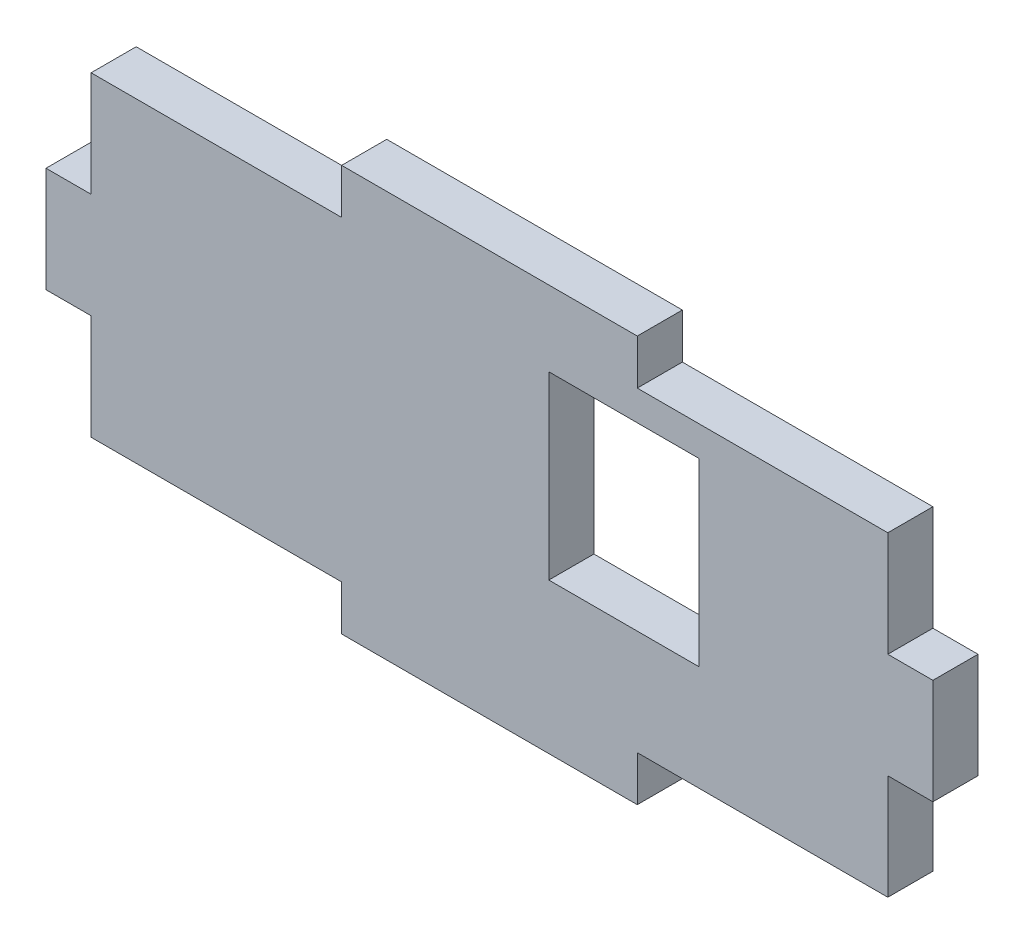
ISO-10303-21;
HEADER;
FILE_DESCRIPTION(('STEP AP214'),'2;1');
FILE_NAME('part.step','',(''),(''),'','','');
FILE_SCHEMA(('AUTOMOTIVE_DESIGN { 1 0 10303 214 1 1 1 1 }'));
ENDSEC;
DATA;
#1=APPLICATION_CONTEXT('core data for automotive mechanical design processes');
#2=APPLICATION_PROTOCOL_DEFINITION('international standard','automotive_design',2000,#1);
#3=PRODUCT_CONTEXT('',#1,'mechanical');
#4=PRODUCT('Part','Part','',(#3));
#5=PRODUCT_RELATED_PRODUCT_CATEGORY('part','',(#4));
#6=PRODUCT_DEFINITION_FORMATION('','',#4);
#7=PRODUCT_DEFINITION_CONTEXT('part definition',#1,'design');
#8=PRODUCT_DEFINITION('design','',#6,#7);
#9=PRODUCT_DEFINITION_SHAPE('','',#8);
#10=(LENGTH_UNIT() NAMED_UNIT(*) SI_UNIT(.MILLI.,.METRE.));
#11=(NAMED_UNIT(*) PLANE_ANGLE_UNIT() SI_UNIT($,.RADIAN.));
#12=(NAMED_UNIT(*) SI_UNIT($,.STERADIAN.) SOLID_ANGLE_UNIT());
#13=UNCERTAINTY_MEASURE_WITH_UNIT(LENGTH_MEASURE(1.E-05),#10,'distance_accuracy_value','');
#14=(GEOMETRIC_REPRESENTATION_CONTEXT(3) GLOBAL_UNCERTAINTY_ASSIGNED_CONTEXT((#13)) GLOBAL_UNIT_ASSIGNED_CONTEXT((#10,
#11,#12)) REPRESENTATION_CONTEXT('',''));
#15=CARTESIAN_POINT('',(0.,0.,0.));
#16=DIRECTION('',(0.,0.,1.));
#17=DIRECTION('',(1.,0.,0.));
#18=AXIS2_PLACEMENT_3D('',#15,#16,#17);
#19=CARTESIAN_POINT('',(0.,0.,3.));
#20=DIRECTION('',(0.,0.,1.));
#21=DIRECTION('',(1.,0.,0.));
#22=AXIS2_PLACEMENT_3D('',#19,#20,#21);
#23=PLANE('',#22);
#24=DIRECTION('',(-1.,0.,0.));
#25=VECTOR('',#24,1.);
#26=CARTESIAN_POINT('',(-26.5,10.5,3.));
#27=LINE('',#26,#25);
#28=CARTESIAN_POINT('',(-9.83333333333334,10.5,3.));
#29=VERTEX_POINT('',#28);
#30=CARTESIAN_POINT('',(-26.5,10.5,3.));
#31=VERTEX_POINT('',#30);
#32=EDGE_CURVE('E230',#29,#31,#27,.T.);
#33=ORIENTED_EDGE('',*,*,#32,.T.);
#34=DIRECTION('',(0.,-1.,0.));
#35=VECTOR('',#34,1.);
#36=CARTESIAN_POINT('',(-26.5,10.5,3.));
#37=LINE('',#36,#35);
#38=CARTESIAN_POINT('',(-26.5,3.5,3.));
#39=VERTEX_POINT('',#38);
#40=EDGE_CURVE('E233',#31,#39,#37,.T.);
#41=ORIENTED_EDGE('',*,*,#40,.T.);
#42=DIRECTION('',(-1.,0.,0.));
#43=VECTOR('',#42,1.);
#44=CARTESIAN_POINT('',(-26.5,3.5,3.));
#45=LINE('',#44,#43);
#46=CARTESIAN_POINT('',(-29.5,3.5,3.));
#47=VERTEX_POINT('',#46);
#48=EDGE_CURVE('E236',#39,#47,#45,.T.);
#49=ORIENTED_EDGE('',*,*,#48,.T.);
#50=DIRECTION('',(0.,-1.,0.));
#51=VECTOR('',#50,1.);
#52=CARTESIAN_POINT('',(-29.5,3.5,3.));
#53=LINE('',#52,#51);
#54=CARTESIAN_POINT('',(-29.5,-3.5,3.));
#55=VERTEX_POINT('',#54);
#56=EDGE_CURVE('E238',#47,#55,#53,.T.);
#57=ORIENTED_EDGE('',*,*,#56,.T.);
#58=DIRECTION('',(1.,0.,0.));
#59=VECTOR('',#58,1.);
#60=CARTESIAN_POINT('',(-29.5,-3.5,3.));
#61=LINE('',#60,#59);
#62=CARTESIAN_POINT('',(-26.5,-3.5,3.));
#63=VERTEX_POINT('',#62);
#64=EDGE_CURVE('E240',#55,#63,#61,.T.);
#65=ORIENTED_EDGE('',*,*,#64,.T.);
#66=DIRECTION('',(0.,-1.,0.));
#67=VECTOR('',#66,1.);
#68=CARTESIAN_POINT('',(-26.5,-3.5,3.));
#69=LINE('',#68,#67);
#70=CARTESIAN_POINT('',(-26.5,-10.5,3.));
#71=VERTEX_POINT('',#70);
#72=EDGE_CURVE('E242',#63,#71,#69,.T.);
#73=ORIENTED_EDGE('',*,*,#72,.T.);
#74=DIRECTION('',(1.,0.,0.));
#75=VECTOR('',#74,1.);
#76=CARTESIAN_POINT('',(-26.5,-10.5,3.));
#77=LINE('',#76,#75);
#78=CARTESIAN_POINT('',(-9.83333333333334,-10.5,3.));
#79=VERTEX_POINT('',#78);
#80=EDGE_CURVE('E244',#71,#79,#77,.T.);
#81=ORIENTED_EDGE('',*,*,#80,.T.);
#82=DIRECTION('',(0.,-1.,0.));
#83=VECTOR('',#82,1.);
#84=CARTESIAN_POINT('',(-9.83333333333334,-10.5,3.));
#85=LINE('',#84,#83);
#86=CARTESIAN_POINT('',(-9.83333333333334,-13.5,3.));
#87=VERTEX_POINT('',#86);
#88=EDGE_CURVE('E246',#79,#87,#85,.T.);
#89=ORIENTED_EDGE('',*,*,#88,.T.);
#90=DIRECTION('',(1.,0.,0.));
#91=VECTOR('',#90,1.);
#92=CARTESIAN_POINT('',(-9.83333333333334,-13.5,3.));
#93=LINE('',#92,#91);
#94=CARTESIAN_POINT('',(9.83333333333333,-13.5,3.));
#95=VERTEX_POINT('',#94);
#96=EDGE_CURVE('E248',#87,#95,#93,.T.);
#97=ORIENTED_EDGE('',*,*,#96,.T.);
#98=DIRECTION('',(0.,1.,0.));
#99=VECTOR('',#98,1.);
#100=CARTESIAN_POINT('',(9.83333333333333,-13.5,3.));
#101=LINE('',#100,#99);
#102=CARTESIAN_POINT('',(9.83333333333334,-10.5,3.));
#103=VERTEX_POINT('',#102);
#104=EDGE_CURVE('E250',#95,#103,#101,.T.);
#105=ORIENTED_EDGE('',*,*,#104,.T.);
#106=DIRECTION('',(1.,0.,0.));
#107=VECTOR('',#106,1.);
#108=CARTESIAN_POINT('',(9.83333333333334,-10.5,3.));
#109=LINE('',#108,#107);
#110=CARTESIAN_POINT('',(26.5,-10.5,3.));
#111=VERTEX_POINT('',#110);
#112=EDGE_CURVE('E252',#103,#111,#109,.T.);
#113=ORIENTED_EDGE('',*,*,#112,.T.);
#114=DIRECTION('',(0.,1.,0.));
#115=VECTOR('',#114,1.);
#116=CARTESIAN_POINT('',(26.5,-3.5,3.));
#117=LINE('',#116,#115);
#118=CARTESIAN_POINT('',(26.5,-3.5,3.));
#119=VERTEX_POINT('',#118);
#120=EDGE_CURVE('E254',#111,#119,#117,.T.);
#121=ORIENTED_EDGE('',*,*,#120,.T.);
#122=DIRECTION('',(1.,0.,0.));
#123=VECTOR('',#122,1.);
#124=CARTESIAN_POINT('',(29.5,-3.5,3.));
#125=LINE('',#124,#123);
#126=CARTESIAN_POINT('',(29.5,-3.5,3.));
#127=VERTEX_POINT('',#126);
#128=EDGE_CURVE('E256',#119,#127,#125,.T.);
#129=ORIENTED_EDGE('',*,*,#128,.T.);
#130=DIRECTION('',(0.,1.,0.));
#131=VECTOR('',#130,1.);
#132=CARTESIAN_POINT('',(29.5,3.5,3.));
#133=LINE('',#132,#131);
#134=CARTESIAN_POINT('',(29.5,3.5,3.));
#135=VERTEX_POINT('',#134);
#136=EDGE_CURVE('E258',#127,#135,#133,.T.);
#137=ORIENTED_EDGE('',*,*,#136,.T.);
#138=DIRECTION('',(-1.,0.,0.));
#139=VECTOR('',#138,1.);
#140=CARTESIAN_POINT('',(26.5,3.5,3.));
#141=LINE('',#140,#139);
#142=CARTESIAN_POINT('',(26.5,3.5,3.));
#143=VERTEX_POINT('',#142);
#144=EDGE_CURVE('E260',#135,#143,#141,.T.);
#145=ORIENTED_EDGE('',*,*,#144,.T.);
#146=DIRECTION('',(0.,1.,0.));
#147=VECTOR('',#146,1.);
#148=CARTESIAN_POINT('',(26.5,10.5,3.));
#149=LINE('',#148,#147);
#150=CARTESIAN_POINT('',(26.5,10.5,3.));
#151=VERTEX_POINT('',#150);
#152=EDGE_CURVE('E262',#143,#151,#149,.T.);
#153=ORIENTED_EDGE('',*,*,#152,.T.);
#154=DIRECTION('',(-1.,0.,0.));
#155=VECTOR('',#154,1.);
#156=CARTESIAN_POINT('',(9.83333333333334,10.5,3.));
#157=LINE('',#156,#155);
#158=CARTESIAN_POINT('',(9.83333333333334,10.5,3.));
#159=VERTEX_POINT('',#158);
#160=EDGE_CURVE('E264',#151,#159,#157,.T.);
#161=ORIENTED_EDGE('',*,*,#160,.T.);
#162=DIRECTION('',(0.,1.,0.));
#163=VECTOR('',#162,1.);
#164=CARTESIAN_POINT('',(9.83333333333333,13.5,3.));
#165=LINE('',#164,#163);
#166=CARTESIAN_POINT('',(9.83333333333333,13.5,3.));
#167=VERTEX_POINT('',#166);
#168=EDGE_CURVE('E266',#159,#167,#165,.T.);
#169=ORIENTED_EDGE('',*,*,#168,.T.);
#170=DIRECTION('',(-1.,0.,0.));
#171=VECTOR('',#170,1.);
#172=CARTESIAN_POINT('',(-9.83333333333333,13.5,3.));
#173=LINE('',#172,#171);
#174=CARTESIAN_POINT('',(-9.83333333333333,13.5,3.));
#175=VERTEX_POINT('',#174);
#176=EDGE_CURVE('E268',#167,#175,#173,.T.);
#177=ORIENTED_EDGE('',*,*,#176,.T.);
#178=DIRECTION('',(0.,-1.,0.));
#179=VECTOR('',#178,1.);
#180=CARTESIAN_POINT('',(-9.83333333333334,10.5,3.));
#181=LINE('',#180,#179);
#182=EDGE_CURVE('E270',#175,#29,#181,.T.);
#183=ORIENTED_EDGE('',*,*,#182,.T.);
#184=EDGE_LOOP('',(#33,#41,#49,#57,#65,#73,#81,#89,#97,#105,#113,#121,#129,#137,#145,#153,#161,
#169,#177,#183));
#185=FACE_BOUND('',#184,.T.);
#186=DIRECTION('',(-1.,0.,0.));
#187=VECTOR('',#186,1.);
#188=CARTESIAN_POINT('',(3.95,8.50000000000001,3.));
#189=LINE('',#188,#187);
#190=CARTESIAN_POINT('',(13.95,8.50000000000001,3.));
#191=VERTEX_POINT('',#190);
#192=CARTESIAN_POINT('',(3.95,8.50000000000001,3.));
#193=VERTEX_POINT('',#192);
#194=EDGE_CURVE('E202',#191,#193,#189,.T.);
#195=ORIENTED_EDGE('',*,*,#194,.F.);
#196=DIRECTION('',(0.,1.,0.));
#197=VECTOR('',#196,1.);
#198=CARTESIAN_POINT('',(13.95,-3.5,3.));
#199=LINE('',#198,#197);
#200=CARTESIAN_POINT('',(13.95,-3.5,3.));
#201=VERTEX_POINT('',#200);
#202=EDGE_CURVE('E194',#201,#191,#199,.T.);
#203=ORIENTED_EDGE('',*,*,#202,.F.);
#204=DIRECTION('',(1.,0.,0.));
#205=VECTOR('',#204,1.);
#206=CARTESIAN_POINT('',(3.95,-3.5,3.));
#207=LINE('',#206,#205);
#208=CARTESIAN_POINT('',(3.95,-3.5,3.));
#209=VERTEX_POINT('',#208);
#210=EDGE_CURVE('E216',#209,#201,#207,.T.);
#211=ORIENTED_EDGE('',*,*,#210,.F.);
#212=DIRECTION('',(0.,-1.,0.));
#213=VECTOR('',#212,1.);
#214=CARTESIAN_POINT('',(3.95,-3.5,3.));
#215=LINE('',#214,#213);
#216=EDGE_CURVE('E214',#193,#209,#215,.T.);
#217=ORIENTED_EDGE('',*,*,#216,.F.);
#218=EDGE_LOOP('',(#195,#203,#211,#217));
#219=FACE_BOUND('',#218,.T.);
#220=ADVANCED_FACE('F33',(#185,#219),#23,.T.);
#221=CARTESIAN_POINT('',(0.,0.,0.));
#222=DIRECTION('',(0.,0.,1.));
#223=DIRECTION('',(1.,0.,0.));
#224=AXIS2_PLACEMENT_3D('',#221,#222,#223);
#225=PLANE('',#224);
#226=DIRECTION('',(-1.,0.,0.));
#227=VECTOR('',#226,1.);
#228=CARTESIAN_POINT('',(-26.5,10.5,0.));
#229=LINE('',#228,#227);
#230=CARTESIAN_POINT('',(-9.83333333333334,10.5,0.));
#231=VERTEX_POINT('',#230);
#232=CARTESIAN_POINT('',(-26.5,10.5,0.));
#233=VERTEX_POINT('',#232);
#234=EDGE_CURVE('E210',#231,#233,#229,.T.);
#235=ORIENTED_EDGE('',*,*,#234,.F.);
#236=DIRECTION('',(0.,-1.,0.));
#237=VECTOR('',#236,1.);
#238=CARTESIAN_POINT('',(-9.83333333333334,10.5,0.));
#239=LINE('',#238,#237);
#240=CARTESIAN_POINT('',(-9.83333333333333,13.5,0.));
#241=VERTEX_POINT('',#240);
#242=EDGE_CURVE('E234',#241,#231,#239,.T.);
#243=ORIENTED_EDGE('',*,*,#242,.F.);
#244=DIRECTION('',(-1.,0.,0.));
#245=VECTOR('',#244,1.);
#246=CARTESIAN_POINT('',(-9.83333333333333,13.5,0.));
#247=LINE('',#246,#245);
#248=CARTESIAN_POINT('',(9.83333333333333,13.5,0.));
#249=VERTEX_POINT('',#248);
#250=EDGE_CURVE('E309',#249,#241,#247,.T.);
#251=ORIENTED_EDGE('',*,*,#250,.F.);
#252=DIRECTION('',(0.,1.,0.));
#253=VECTOR('',#252,1.);
#254=CARTESIAN_POINT('',(9.83333333333333,13.5,0.));
#255=LINE('',#254,#253);
#256=CARTESIAN_POINT('',(9.83333333333334,10.5,0.));
#257=VERTEX_POINT('',#256);
#258=EDGE_CURVE('E307',#257,#249,#255,.T.);
#259=ORIENTED_EDGE('',*,*,#258,.F.);
#260=DIRECTION('',(-1.,0.,0.));
#261=VECTOR('',#260,1.);
#262=CARTESIAN_POINT('',(9.83333333333334,10.5,0.));
#263=LINE('',#262,#261);
#264=CARTESIAN_POINT('',(26.5,10.5,0.));
#265=VERTEX_POINT('',#264);
#266=EDGE_CURVE('E305',#265,#257,#263,.T.);
#267=ORIENTED_EDGE('',*,*,#266,.F.);
#268=DIRECTION('',(0.,1.,0.));
#269=VECTOR('',#268,1.);
#270=CARTESIAN_POINT('',(26.5,10.5,0.));
#271=LINE('',#270,#269);
#272=CARTESIAN_POINT('',(26.5,3.5,0.));
#273=VERTEX_POINT('',#272);
#274=EDGE_CURVE('E303',#273,#265,#271,.T.);
#275=ORIENTED_EDGE('',*,*,#274,.F.);
#276=DIRECTION('',(-1.,0.,0.));
#277=VECTOR('',#276,1.);
#278=CARTESIAN_POINT('',(26.5,3.5,0.));
#279=LINE('',#278,#277);
#280=CARTESIAN_POINT('',(29.5,3.5,0.));
#281=VERTEX_POINT('',#280);
#282=EDGE_CURVE('E301',#281,#273,#279,.T.);
#283=ORIENTED_EDGE('',*,*,#282,.F.);
#284=DIRECTION('',(0.,1.,0.));
#285=VECTOR('',#284,1.);
#286=CARTESIAN_POINT('',(29.5,3.5,0.));
#287=LINE('',#286,#285);
#288=CARTESIAN_POINT('',(29.5,-3.5,0.));
#289=VERTEX_POINT('',#288);
#290=EDGE_CURVE('E299',#289,#281,#287,.T.);
#291=ORIENTED_EDGE('',*,*,#290,.F.);
#292=DIRECTION('',(1.,0.,0.));
#293=VECTOR('',#292,1.);
#294=CARTESIAN_POINT('',(29.5,-3.5,0.));
#295=LINE('',#294,#293);
#296=CARTESIAN_POINT('',(26.5,-3.5,0.));
#297=VERTEX_POINT('',#296);
#298=EDGE_CURVE('E297',#297,#289,#295,.T.);
#299=ORIENTED_EDGE('',*,*,#298,.F.);
#300=DIRECTION('',(0.,1.,0.));
#301=VECTOR('',#300,1.);
#302=CARTESIAN_POINT('',(26.5,-3.5,0.));
#303=LINE('',#302,#301);
#304=CARTESIAN_POINT('',(26.5,-10.5,0.));
#305=VERTEX_POINT('',#304);
#306=EDGE_CURVE('E295',#305,#297,#303,.T.);
#307=ORIENTED_EDGE('',*,*,#306,.F.);
#308=DIRECTION('',(1.,0.,0.));
#309=VECTOR('',#308,1.);
#310=CARTESIAN_POINT('',(9.83333333333334,-10.5,0.));
#311=LINE('',#310,#309);
#312=CARTESIAN_POINT('',(9.83333333333334,-10.5,0.));
#313=VERTEX_POINT('',#312);
#314=EDGE_CURVE('E293',#313,#305,#311,.T.);
#315=ORIENTED_EDGE('',*,*,#314,.F.);
#316=DIRECTION('',(0.,1.,0.));
#317=VECTOR('',#316,1.);
#318=CARTESIAN_POINT('',(9.83333333333333,-13.5,0.));
#319=LINE('',#318,#317);
#320=CARTESIAN_POINT('',(9.83333333333333,-13.5,0.));
#321=VERTEX_POINT('',#320);
#322=EDGE_CURVE('E291',#321,#313,#319,.T.);
#323=ORIENTED_EDGE('',*,*,#322,.F.);
#324=DIRECTION('',(1.,0.,0.));
#325=VECTOR('',#324,1.);
#326=CARTESIAN_POINT('',(-9.83333333333334,-13.5,0.));
#327=LINE('',#326,#325);
#328=CARTESIAN_POINT('',(-9.83333333333334,-13.5,0.));
#329=VERTEX_POINT('',#328);
#330=EDGE_CURVE('E289',#329,#321,#327,.T.);
#331=ORIENTED_EDGE('',*,*,#330,.F.);
#332=DIRECTION('',(0.,-1.,0.));
#333=VECTOR('',#332,1.);
#334=CARTESIAN_POINT('',(-9.83333333333334,-10.5,0.));
#335=LINE('',#334,#333);
#336=CARTESIAN_POINT('',(-9.83333333333334,-10.5,0.));
#337=VERTEX_POINT('',#336);
#338=EDGE_CURVE('E287',#337,#329,#335,.T.);
#339=ORIENTED_EDGE('',*,*,#338,.F.);
#340=DIRECTION('',(1.,0.,0.));
#341=VECTOR('',#340,1.);
#342=CARTESIAN_POINT('',(-26.5,-10.5,0.));
#343=LINE('',#342,#341);
#344=CARTESIAN_POINT('',(-26.5,-10.5,0.));
#345=VERTEX_POINT('',#344);
#346=EDGE_CURVE('E285',#345,#337,#343,.T.);
#347=ORIENTED_EDGE('',*,*,#346,.F.);
#348=DIRECTION('',(0.,-1.,0.));
#349=VECTOR('',#348,1.);
#350=CARTESIAN_POINT('',(-26.5,-3.5,0.));
#351=LINE('',#350,#349);
#352=CARTESIAN_POINT('',(-26.5,-3.5,0.));
#353=VERTEX_POINT('',#352);
#354=EDGE_CURVE('E283',#353,#345,#351,.T.);
#355=ORIENTED_EDGE('',*,*,#354,.F.);
#356=DIRECTION('',(1.,0.,0.));
#357=VECTOR('',#356,1.);
#358=CARTESIAN_POINT('',(-29.5,-3.5,0.));
#359=LINE('',#358,#357);
#360=CARTESIAN_POINT('',(-29.5,-3.5,0.));
#361=VERTEX_POINT('',#360);
#362=EDGE_CURVE('E281',#361,#353,#359,.T.);
#363=ORIENTED_EDGE('',*,*,#362,.F.);
#364=DIRECTION('',(0.,-1.,0.));
#365=VECTOR('',#364,1.);
#366=CARTESIAN_POINT('',(-29.5,3.5,0.));
#367=LINE('',#366,#365);
#368=CARTESIAN_POINT('',(-29.5,3.5,0.));
#369=VERTEX_POINT('',#368);
#370=EDGE_CURVE('E279',#369,#361,#367,.T.);
#371=ORIENTED_EDGE('',*,*,#370,.F.);
#372=DIRECTION('',(-1.,0.,0.));
#373=VECTOR('',#372,1.);
#374=CARTESIAN_POINT('',(-26.5,3.5,0.));
#375=LINE('',#374,#373);
#376=CARTESIAN_POINT('',(-26.5,3.5,0.));
#377=VERTEX_POINT('',#376);
#378=EDGE_CURVE('E277',#377,#369,#375,.T.);
#379=ORIENTED_EDGE('',*,*,#378,.F.);
#380=DIRECTION('',(0.,-1.,0.));
#381=VECTOR('',#380,1.);
#382=CARTESIAN_POINT('',(-26.5,10.5,0.));
#383=LINE('',#382,#381);
#384=EDGE_CURVE('E275',#233,#377,#383,.T.);
#385=ORIENTED_EDGE('',*,*,#384,.F.);
#386=EDGE_LOOP('',(#235,#243,#251,#259,#267,#275,#283,#291,#299,#307,#315,#323,#331,#339,#347,
#355,#363,#371,#379,#385));
#387=FACE_BOUND('',#386,.T.);
#388=DIRECTION('',(0.,1.,0.));
#389=VECTOR('',#388,1.);
#390=CARTESIAN_POINT('',(13.95,-3.5,0.));
#391=LINE('',#390,#389);
#392=CARTESIAN_POINT('',(13.95,-3.5,0.));
#393=VERTEX_POINT('',#392);
#394=CARTESIAN_POINT('',(13.95,8.50000000000001,0.));
#395=VERTEX_POINT('',#394);
#396=EDGE_CURVE('E56',#393,#395,#391,.T.);
#397=ORIENTED_EDGE('',*,*,#396,.T.);
#398=DIRECTION('',(-1.,0.,0.));
#399=VECTOR('',#398,1.);
#400=CARTESIAN_POINT('',(3.95,8.50000000000001,0.));
#401=LINE('',#400,#399);
#402=CARTESIAN_POINT('',(3.95,8.50000000000001,0.));
#403=VERTEX_POINT('',#402);
#404=EDGE_CURVE('E209',#395,#403,#401,.T.);
#405=ORIENTED_EDGE('',*,*,#404,.T.);
#406=DIRECTION('',(0.,-1.,0.));
#407=VECTOR('',#406,1.);
#408=CARTESIAN_POINT('',(3.95,-3.5,0.));
#409=LINE('',#408,#407);
#410=CARTESIAN_POINT('',(3.95,-3.5,0.));
#411=VERTEX_POINT('',#410);
#412=EDGE_CURVE('E222',#403,#411,#409,.T.);
#413=ORIENTED_EDGE('',*,*,#412,.T.);
#414=DIRECTION('',(1.,0.,0.));
#415=VECTOR('',#414,1.);
#416=CARTESIAN_POINT('',(3.95,-3.5,0.));
#417=LINE('',#416,#415);
#418=EDGE_CURVE('E203',#411,#393,#417,.T.);
#419=ORIENTED_EDGE('',*,*,#418,.T.);
#420=EDGE_LOOP('',(#397,#405,#413,#419));
#421=FACE_BOUND('',#420,.T.);
#422=ADVANCED_FACE('F375',(#387,#421),#225,.F.);
#423=CARTESIAN_POINT('',(-26.5,10.5,3.));
#424=DIRECTION('',(0.,-1.,0.));
#425=DIRECTION('',(1.,0.,0.));
#426=AXIS2_PLACEMENT_3D('',#423,#424,#425);
#427=PLANE('',#426);
#428=ORIENTED_EDGE('',*,*,#234,.T.);
#429=DIRECTION('',(0.,0.,-1.));
#430=VECTOR('',#429,1.);
#431=CARTESIAN_POINT('',(-26.5,10.5,3.));
#432=LINE('',#431,#430);
#433=EDGE_CURVE('E11',#31,#233,#432,.T.);
#434=ORIENTED_EDGE('',*,*,#433,.F.);
#435=ORIENTED_EDGE('',*,*,#32,.F.);
#436=DIRECTION('',(0.,0.,-1.));
#437=VECTOR('',#436,1.);
#438=CARTESIAN_POINT('',(-9.83333333333334,10.5,3.));
#439=LINE('',#438,#437);
#440=EDGE_CURVE('E272',#29,#231,#439,.T.);
#441=ORIENTED_EDGE('',*,*,#440,.T.);
#442=EDGE_LOOP('',(#428,#434,#435,#441));
#443=FACE_BOUND('',#442,.T.);
#444=ADVANCED_FACE('F35',(#443),#427,.F.);
#445=CARTESIAN_POINT('',(-26.5,10.5,3.));
#446=DIRECTION('',(1.,0.,0.));
#447=DIRECTION('',(0.,0.,-1.));
#448=AXIS2_PLACEMENT_3D('',#445,#446,#447);
#449=PLANE('',#448);
#450=ORIENTED_EDGE('',*,*,#384,.T.);
#451=DIRECTION('',(0.,0.,-1.));
#452=VECTOR('',#451,1.);
#453=CARTESIAN_POINT('',(-26.5,3.5,3.));
#454=LINE('',#453,#452);
#455=EDGE_CURVE('E41',#39,#377,#454,.T.);
#456=ORIENTED_EDGE('',*,*,#455,.F.);
#457=ORIENTED_EDGE('',*,*,#40,.F.);
#458=ORIENTED_EDGE('',*,*,#433,.T.);
#459=EDGE_LOOP('',(#450,#456,#457,#458));
#460=FACE_BOUND('',#459,.T.);
#461=ADVANCED_FACE('F392',(#460),#449,.F.);
#462=CARTESIAN_POINT('',(-26.5,3.5,3.));
#463=DIRECTION('',(0.,-1.,0.));
#464=DIRECTION('',(1.,0.,0.));
#465=AXIS2_PLACEMENT_3D('',#462,#463,#464);
#466=PLANE('',#465);
#467=ORIENTED_EDGE('',*,*,#378,.T.);
#468=DIRECTION('',(0.,0.,-1.));
#469=VECTOR('',#468,1.);
#470=CARTESIAN_POINT('',(-29.5,3.5,3.));
#471=LINE('',#470,#469);
#472=EDGE_CURVE('E362',#47,#369,#471,.T.);
#473=ORIENTED_EDGE('',*,*,#472,.F.);
#474=ORIENTED_EDGE('',*,*,#48,.F.);
#475=ORIENTED_EDGE('',*,*,#455,.T.);
#476=EDGE_LOOP('',(#467,#473,#474,#475));
#477=FACE_BOUND('',#476,.T.);
#478=ADVANCED_FACE('F369',(#477),#466,.F.);
#479=CARTESIAN_POINT('',(-29.5,3.5,3.));
#480=DIRECTION('',(1.,0.,0.));
#481=DIRECTION('',(0.,1.,0.));
#482=AXIS2_PLACEMENT_3D('',#479,#480,#481);
#483=PLANE('',#482);
#484=ORIENTED_EDGE('',*,*,#370,.T.);
#485=DIRECTION('',(0.,0.,-1.));
#486=VECTOR('',#485,1.);
#487=CARTESIAN_POINT('',(-29.5,-3.5,3.));
#488=LINE('',#487,#486);
#489=EDGE_CURVE('E359',#55,#361,#488,.T.);
#490=ORIENTED_EDGE('',*,*,#489,.F.);
#491=ORIENTED_EDGE('',*,*,#56,.F.);
#492=ORIENTED_EDGE('',*,*,#472,.T.);
#493=EDGE_LOOP('',(#484,#490,#491,#492));
#494=FACE_BOUND('',#493,.T.);
#495=ADVANCED_FACE('F381',(#494),#483,.F.);
#496=CARTESIAN_POINT('',(-29.5,-3.5,3.));
#497=DIRECTION('',(0.,1.,0.));
#498=DIRECTION('',(0.,0.,1.));
#499=AXIS2_PLACEMENT_3D('',#496,#497,#498);
#500=PLANE('',#499);
#501=ORIENTED_EDGE('',*,*,#362,.T.);
#502=DIRECTION('',(0.,0.,-1.));
#503=VECTOR('',#502,1.);
#504=CARTESIAN_POINT('',(-26.5,-3.5,3.));
#505=LINE('',#504,#503);
#506=EDGE_CURVE('E356',#63,#353,#505,.T.);
#507=ORIENTED_EDGE('',*,*,#506,.F.);
#508=ORIENTED_EDGE('',*,*,#64,.F.);
#509=ORIENTED_EDGE('',*,*,#489,.T.);
#510=EDGE_LOOP('',(#501,#507,#508,#509));
#511=FACE_BOUND('',#510,.T.);
#512=ADVANCED_FACE('F385',(#511),#500,.F.);
#513=CARTESIAN_POINT('',(-26.5,-3.5,3.));
#514=DIRECTION('',(1.,0.,0.));
#515=DIRECTION('',(0.,0.,-1.));
#516=AXIS2_PLACEMENT_3D('',#513,#514,#515);
#517=PLANE('',#516);
#518=ORIENTED_EDGE('',*,*,#354,.T.);
#519=DIRECTION('',(0.,0.,-1.));
#520=VECTOR('',#519,1.);
#521=CARTESIAN_POINT('',(-26.5,-10.5,3.));
#522=LINE('',#521,#520);
#523=EDGE_CURVE('E353',#71,#345,#522,.T.);
#524=ORIENTED_EDGE('',*,*,#523,.F.);
#525=ORIENTED_EDGE('',*,*,#72,.F.);
#526=ORIENTED_EDGE('',*,*,#506,.T.);
#527=EDGE_LOOP('',(#518,#524,#525,#526));
#528=FACE_BOUND('',#527,.T.);
#529=ADVANCED_FACE('F465',(#528),#517,.F.);
#530=CARTESIAN_POINT('',(-26.5,-10.5,3.));
#531=DIRECTION('',(0.,1.,0.));
#532=DIRECTION('',(0.,0.,1.));
#533=AXIS2_PLACEMENT_3D('',#530,#531,#532);
#534=PLANE('',#533);
#535=ORIENTED_EDGE('',*,*,#346,.T.);
#536=DIRECTION('',(0.,0.,-1.));
#537=VECTOR('',#536,1.);
#538=CARTESIAN_POINT('',(-9.83333333333334,-10.5,3.));
#539=LINE('',#538,#537);
#540=EDGE_CURVE('E350',#79,#337,#539,.T.);
#541=ORIENTED_EDGE('',*,*,#540,.F.);
#542=ORIENTED_EDGE('',*,*,#80,.F.);
#543=ORIENTED_EDGE('',*,*,#523,.T.);
#544=EDGE_LOOP('',(#535,#541,#542,#543));
#545=FACE_BOUND('',#544,.T.);
#546=ADVANCED_FACE('F463',(#545),#534,.F.);
#547=CARTESIAN_POINT('',(-9.83333333333334,-10.5,3.));
#548=DIRECTION('',(1.,0.,0.));
#549=DIRECTION('',(0.,0.,-1.));
#550=AXIS2_PLACEMENT_3D('',#547,#548,#549);
#551=PLANE('',#550);
#552=ORIENTED_EDGE('',*,*,#338,.T.);
#553=DIRECTION('',(0.,0.,-1.));
#554=VECTOR('',#553,1.);
#555=CARTESIAN_POINT('',(-9.83333333333334,-13.5,3.));
#556=LINE('',#555,#554);
#557=EDGE_CURVE('E347',#87,#329,#556,.T.);
#558=ORIENTED_EDGE('',*,*,#557,.F.);
#559=ORIENTED_EDGE('',*,*,#88,.F.);
#560=ORIENTED_EDGE('',*,*,#540,.T.);
#561=EDGE_LOOP('',(#552,#558,#559,#560));
#562=FACE_BOUND('',#561,.T.);
#563=ADVANCED_FACE('F458',(#562),#551,.F.);
#564=CARTESIAN_POINT('',(-9.83333333333334,-13.5,3.));
#565=DIRECTION('',(0.,1.,0.));
#566=DIRECTION('',(-1.,0.,0.));
#567=AXIS2_PLACEMENT_3D('',#564,#565,#566);
#568=PLANE('',#567);
#569=ORIENTED_EDGE('',*,*,#330,.T.);
#570=DIRECTION('',(0.,0.,-1.));
#571=VECTOR('',#570,1.);
#572=CARTESIAN_POINT('',(9.83333333333333,-13.5,3.));
#573=LINE('',#572,#571);
#574=EDGE_CURVE('E344',#95,#321,#573,.T.);
#575=ORIENTED_EDGE('',*,*,#574,.F.);
#576=ORIENTED_EDGE('',*,*,#96,.F.);
#577=ORIENTED_EDGE('',*,*,#557,.T.);
#578=EDGE_LOOP('',(#569,#575,#576,#577));
#579=FACE_BOUND('',#578,.T.);
#580=ADVANCED_FACE('F453',(#579),#568,.F.);
#581=CARTESIAN_POINT('',(9.83333333333333,-13.5,3.));
#582=DIRECTION('',(-1.,0.,0.));
#583=DIRECTION('',(0.,-1.,0.));
#584=AXIS2_PLACEMENT_3D('',#581,#582,#583);
#585=PLANE('',#584);
#586=ORIENTED_EDGE('',*,*,#322,.T.);
#587=DIRECTION('',(0.,0.,-1.));
#588=VECTOR('',#587,1.);
#589=CARTESIAN_POINT('',(9.83333333333334,-10.5,3.));
#590=LINE('',#589,#588);
#591=EDGE_CURVE('E341',#103,#313,#590,.T.);
#592=ORIENTED_EDGE('',*,*,#591,.F.);
#593=ORIENTED_EDGE('',*,*,#104,.F.);
#594=ORIENTED_EDGE('',*,*,#574,.T.);
#595=EDGE_LOOP('',(#586,#592,#593,#594));
#596=FACE_BOUND('',#595,.T.);
#597=ADVANCED_FACE('F449',(#596),#585,.F.);
#598=CARTESIAN_POINT('',(9.83333333333334,-10.5,3.));
#599=DIRECTION('',(0.,1.,0.));
#600=DIRECTION('',(-1.,0.,0.));
#601=AXIS2_PLACEMENT_3D('',#598,#599,#600);
#602=PLANE('',#601);
#603=ORIENTED_EDGE('',*,*,#314,.T.);
#604=DIRECTION('',(0.,0.,-1.));
#605=VECTOR('',#604,1.);
#606=CARTESIAN_POINT('',(26.5,-10.5,3.));
#607=LINE('',#606,#605);
#608=EDGE_CURVE('E338',#111,#305,#607,.T.);
#609=ORIENTED_EDGE('',*,*,#608,.F.);
#610=ORIENTED_EDGE('',*,*,#112,.F.);
#611=ORIENTED_EDGE('',*,*,#591,.T.);
#612=EDGE_LOOP('',(#603,#609,#610,#611));
#613=FACE_BOUND('',#612,.T.);
#614=ADVANCED_FACE('F444',(#613),#602,.F.);
#615=CARTESIAN_POINT('',(26.5,-3.5,3.));
#616=DIRECTION('',(-1.,0.,0.));
#617=DIRECTION('',(0.,0.,1.));
#618=AXIS2_PLACEMENT_3D('',#615,#616,#617);
#619=PLANE('',#618);
#620=ORIENTED_EDGE('',*,*,#306,.T.);
#621=DIRECTION('',(0.,0.,-1.));
#622=VECTOR('',#621,1.);
#623=CARTESIAN_POINT('',(26.5,-3.5,3.));
#624=LINE('',#623,#622);
#625=EDGE_CURVE('E335',#119,#297,#624,.T.);
#626=ORIENTED_EDGE('',*,*,#625,.F.);
#627=ORIENTED_EDGE('',*,*,#120,.F.);
#628=ORIENTED_EDGE('',*,*,#608,.T.);
#629=EDGE_LOOP('',(#620,#626,#627,#628));
#630=FACE_BOUND('',#629,.T.);
#631=ADVANCED_FACE('F438',(#630),#619,.F.);
#632=CARTESIAN_POINT('',(29.5,-3.5,3.));
#633=DIRECTION('',(0.,1.,0.));
#634=DIRECTION('',(-1.,0.,0.));
#635=AXIS2_PLACEMENT_3D('',#632,#633,#634);
#636=PLANE('',#635);
#637=ORIENTED_EDGE('',*,*,#298,.T.);
#638=DIRECTION('',(0.,0.,-1.));
#639=VECTOR('',#638,1.);
#640=CARTESIAN_POINT('',(29.5,-3.5,3.));
#641=LINE('',#640,#639);
#642=EDGE_CURVE('E332',#127,#289,#641,.T.);
#643=ORIENTED_EDGE('',*,*,#642,.F.);
#644=ORIENTED_EDGE('',*,*,#128,.F.);
#645=ORIENTED_EDGE('',*,*,#625,.T.);
#646=EDGE_LOOP('',(#637,#643,#644,#645));
#647=FACE_BOUND('',#646,.T.);
#648=ADVANCED_FACE('F434',(#647),#636,.F.);
#649=CARTESIAN_POINT('',(29.5,3.5,3.));
#650=DIRECTION('',(-1.,0.,0.));
#651=DIRECTION('',(0.,0.,1.));
#652=AXIS2_PLACEMENT_3D('',#649,#650,#651);
#653=PLANE('',#652);
#654=ORIENTED_EDGE('',*,*,#290,.T.);
#655=DIRECTION('',(0.,0.,-1.));
#656=VECTOR('',#655,1.);
#657=CARTESIAN_POINT('',(29.5,3.5,3.));
#658=LINE('',#657,#656);
#659=EDGE_CURVE('E329',#135,#281,#658,.T.);
#660=ORIENTED_EDGE('',*,*,#659,.F.);
#661=ORIENTED_EDGE('',*,*,#136,.F.);
#662=ORIENTED_EDGE('',*,*,#642,.T.);
#663=EDGE_LOOP('',(#654,#660,#661,#662));
#664=FACE_BOUND('',#663,.T.);
#665=ADVANCED_FACE('F429',(#664),#653,.F.);
#666=CARTESIAN_POINT('',(26.5,3.5,3.));
#667=DIRECTION('',(0.,-1.,0.));
#668=DIRECTION('',(1.,0.,0.));
#669=AXIS2_PLACEMENT_3D('',#666,#667,#668);
#670=PLANE('',#669);
#671=ORIENTED_EDGE('',*,*,#282,.T.);
#672=DIRECTION('',(0.,0.,-1.));
#673=VECTOR('',#672,1.);
#674=CARTESIAN_POINT('',(26.5,3.5,3.));
#675=LINE('',#674,#673);
#676=EDGE_CURVE('E326',#143,#273,#675,.T.);
#677=ORIENTED_EDGE('',*,*,#676,.F.);
#678=ORIENTED_EDGE('',*,*,#144,.F.);
#679=ORIENTED_EDGE('',*,*,#659,.T.);
#680=EDGE_LOOP('',(#671,#677,#678,#679));
#681=FACE_BOUND('',#680,.T.);
#682=ADVANCED_FACE('F423',(#681),#670,.F.);
#683=CARTESIAN_POINT('',(26.5,10.5,3.));
#684=DIRECTION('',(-1.,0.,0.));
#685=DIRECTION('',(0.,0.,1.));
#686=AXIS2_PLACEMENT_3D('',#683,#684,#685);
#687=PLANE('',#686);
#688=ORIENTED_EDGE('',*,*,#274,.T.);
#689=DIRECTION('',(0.,0.,-1.));
#690=VECTOR('',#689,1.);
#691=CARTESIAN_POINT('',(26.5,10.5,3.));
#692=LINE('',#691,#690);
#693=EDGE_CURVE('E323',#151,#265,#692,.T.);
#694=ORIENTED_EDGE('',*,*,#693,.F.);
#695=ORIENTED_EDGE('',*,*,#152,.F.);
#696=ORIENTED_EDGE('',*,*,#676,.T.);
#697=EDGE_LOOP('',(#688,#694,#695,#696));
#698=FACE_BOUND('',#697,.T.);
#699=ADVANCED_FACE('F419',(#698),#687,.F.);
#700=CARTESIAN_POINT('',(9.83333333333334,10.5,3.));
#701=DIRECTION('',(0.,-1.,0.));
#702=DIRECTION('',(1.,0.,0.));
#703=AXIS2_PLACEMENT_3D('',#700,#701,#702);
#704=PLANE('',#703);
#705=ORIENTED_EDGE('',*,*,#266,.T.);
#706=DIRECTION('',(0.,0.,-1.));
#707=VECTOR('',#706,1.);
#708=CARTESIAN_POINT('',(9.83333333333334,10.5,3.));
#709=LINE('',#708,#707);
#710=EDGE_CURVE('E320',#159,#257,#709,.T.);
#711=ORIENTED_EDGE('',*,*,#710,.F.);
#712=ORIENTED_EDGE('',*,*,#160,.F.);
#713=ORIENTED_EDGE('',*,*,#693,.T.);
#714=EDGE_LOOP('',(#705,#711,#712,#713));
#715=FACE_BOUND('',#714,.T.);
#716=ADVANCED_FACE('F414',(#715),#704,.F.);
#717=CARTESIAN_POINT('',(9.83333333333333,13.5,3.));
#718=DIRECTION('',(-1.,0.,0.));
#719=DIRECTION('',(0.,-1.,0.));
#720=AXIS2_PLACEMENT_3D('',#717,#718,#719);
#721=PLANE('',#720);
#722=ORIENTED_EDGE('',*,*,#258,.T.);
#723=DIRECTION('',(0.,0.,-1.));
#724=VECTOR('',#723,1.);
#725=CARTESIAN_POINT('',(9.83333333333333,13.5,3.));
#726=LINE('',#725,#724);
#727=EDGE_CURVE('E317',#167,#249,#726,.T.);
#728=ORIENTED_EDGE('',*,*,#727,.F.);
#729=ORIENTED_EDGE('',*,*,#168,.F.);
#730=ORIENTED_EDGE('',*,*,#710,.T.);
#731=EDGE_LOOP('',(#722,#728,#729,#730));
#732=FACE_BOUND('',#731,.T.);
#733=ADVANCED_FACE('F408',(#732),#721,.F.);
#734=CARTESIAN_POINT('',(-9.83333333333333,13.5,3.));
#735=DIRECTION('',(0.,-1.,0.));
#736=DIRECTION('',(0.,0.,-1.));
#737=AXIS2_PLACEMENT_3D('',#734,#735,#736);
#738=PLANE('',#737);
#739=ORIENTED_EDGE('',*,*,#250,.T.);
#740=DIRECTION('',(0.,0.,-1.));
#741=VECTOR('',#740,1.);
#742=CARTESIAN_POINT('',(-9.83333333333333,13.5,3.));
#743=LINE('',#742,#741);
#744=EDGE_CURVE('E314',#175,#241,#743,.T.);
#745=ORIENTED_EDGE('',*,*,#744,.F.);
#746=ORIENTED_EDGE('',*,*,#176,.F.);
#747=ORIENTED_EDGE('',*,*,#727,.T.);
#748=EDGE_LOOP('',(#739,#745,#746,#747));
#749=FACE_BOUND('',#748,.T.);
#750=ADVANCED_FACE('F404',(#749),#738,.F.);
#751=CARTESIAN_POINT('',(-9.83333333333334,10.5,3.));
#752=DIRECTION('',(1.,0.,0.));
#753=DIRECTION('',(0.,1.,0.));
#754=AXIS2_PLACEMENT_3D('',#751,#752,#753);
#755=PLANE('',#754);
#756=ORIENTED_EDGE('',*,*,#242,.T.);
#757=ORIENTED_EDGE('',*,*,#440,.F.);
#758=ORIENTED_EDGE('',*,*,#182,.F.);
#759=ORIENTED_EDGE('',*,*,#744,.T.);
#760=EDGE_LOOP('',(#756,#757,#758,#759));
#761=FACE_BOUND('',#760,.T.);
#762=ADVANCED_FACE('F399',(#761),#755,.F.);
#763=CARTESIAN_POINT('',(13.95,-3.5,3.));
#764=DIRECTION('',(-1.,0.,0.));
#765=DIRECTION('',(0.,0.,1.));
#766=AXIS2_PLACEMENT_3D('',#763,#764,#765);
#767=PLANE('',#766);
#768=ORIENTED_EDGE('',*,*,#396,.F.);
#769=DIRECTION('',(0.,0.,-1.));
#770=VECTOR('',#769,1.);
#771=CARTESIAN_POINT('',(13.95,-3.5,3.));
#772=LINE('',#771,#770);
#773=EDGE_CURVE('E198',#201,#393,#772,.T.);
#774=ORIENTED_EDGE('',*,*,#773,.F.);
#775=ORIENTED_EDGE('',*,*,#202,.T.);
#776=DIRECTION('',(0.,0.,-1.));
#777=VECTOR('',#776,1.);
#778=CARTESIAN_POINT('',(13.95,8.50000000000001,3.));
#779=LINE('',#778,#777);
#780=EDGE_CURVE('E197',#191,#395,#779,.T.);
#781=ORIENTED_EDGE('',*,*,#780,.T.);
#782=EDGE_LOOP('',(#768,#774,#775,#781));
#783=FACE_BOUND('',#782,.T.);
#784=ADVANCED_FACE('F196',(#783),#767,.T.);
#785=CARTESIAN_POINT('',(3.95,8.50000000000001,3.));
#786=DIRECTION('',(0.,-1.,0.));
#787=DIRECTION('',(0.,0.,-1.));
#788=AXIS2_PLACEMENT_3D('',#785,#786,#787);
#789=PLANE('',#788);
#790=ORIENTED_EDGE('',*,*,#404,.F.);
#791=ORIENTED_EDGE('',*,*,#780,.F.);
#792=ORIENTED_EDGE('',*,*,#194,.T.);
#793=DIRECTION('',(0.,0.,-1.));
#794=VECTOR('',#793,1.);
#795=CARTESIAN_POINT('',(3.95,8.50000000000001,3.));
#796=LINE('',#795,#794);
#797=EDGE_CURVE('E211',#193,#403,#796,.T.);
#798=ORIENTED_EDGE('',*,*,#797,.T.);
#799=EDGE_LOOP('',(#790,#791,#792,#798));
#800=FACE_BOUND('',#799,.T.);
#801=ADVANCED_FACE('F206',(#800),#789,.T.);
#802=CARTESIAN_POINT('',(3.95,-3.5,3.));
#803=DIRECTION('',(1.,0.,0.));
#804=DIRECTION('',(0.,1.,0.));
#805=AXIS2_PLACEMENT_3D('',#802,#803,#804);
#806=PLANE('',#805);
#807=ORIENTED_EDGE('',*,*,#412,.F.);
#808=ORIENTED_EDGE('',*,*,#797,.F.);
#809=ORIENTED_EDGE('',*,*,#216,.T.);
#810=DIRECTION('',(0.,0.,-1.));
#811=VECTOR('',#810,1.);
#812=CARTESIAN_POINT('',(3.95,-3.5,3.));
#813=LINE('',#812,#811);
#814=EDGE_CURVE('E48',#209,#411,#813,.T.);
#815=ORIENTED_EDGE('',*,*,#814,.T.);
#816=EDGE_LOOP('',(#807,#808,#809,#815));
#817=FACE_BOUND('',#816,.T.);
#818=ADVANCED_FACE('F571',(#817),#806,.T.);
#819=CARTESIAN_POINT('',(3.95,-3.5,3.));
#820=DIRECTION('',(0.,1.,0.));
#821=DIRECTION('',(0.,0.,1.));
#822=AXIS2_PLACEMENT_3D('',#819,#820,#821);
#823=PLANE('',#822);
#824=ORIENTED_EDGE('',*,*,#418,.F.);
#825=ORIENTED_EDGE('',*,*,#814,.F.);
#826=ORIENTED_EDGE('',*,*,#210,.T.);
#827=ORIENTED_EDGE('',*,*,#773,.T.);
#828=EDGE_LOOP('',(#824,#825,#826,#827));
#829=FACE_BOUND('',#828,.T.);
#830=ADVANCED_FACE('F577',(#829),#823,.T.);
#831=CLOSED_SHELL('',(#220,#422,#444,#461,#478,#495,#512,#529,#546,#563,#580,#597,#614,#631,
#648,#665,#682,#699,#716,#733,#750,#762,#784,#801,#818,#830));
#832=MANIFOLD_SOLID_BREP('B2',#831);
#833=ADVANCED_BREP_SHAPE_REPRESENTATION('',(#18,#832),#14);
#834=SHAPE_DEFINITION_REPRESENTATION(#9,#833);
ENDSEC;
END-ISO-10303-21;
